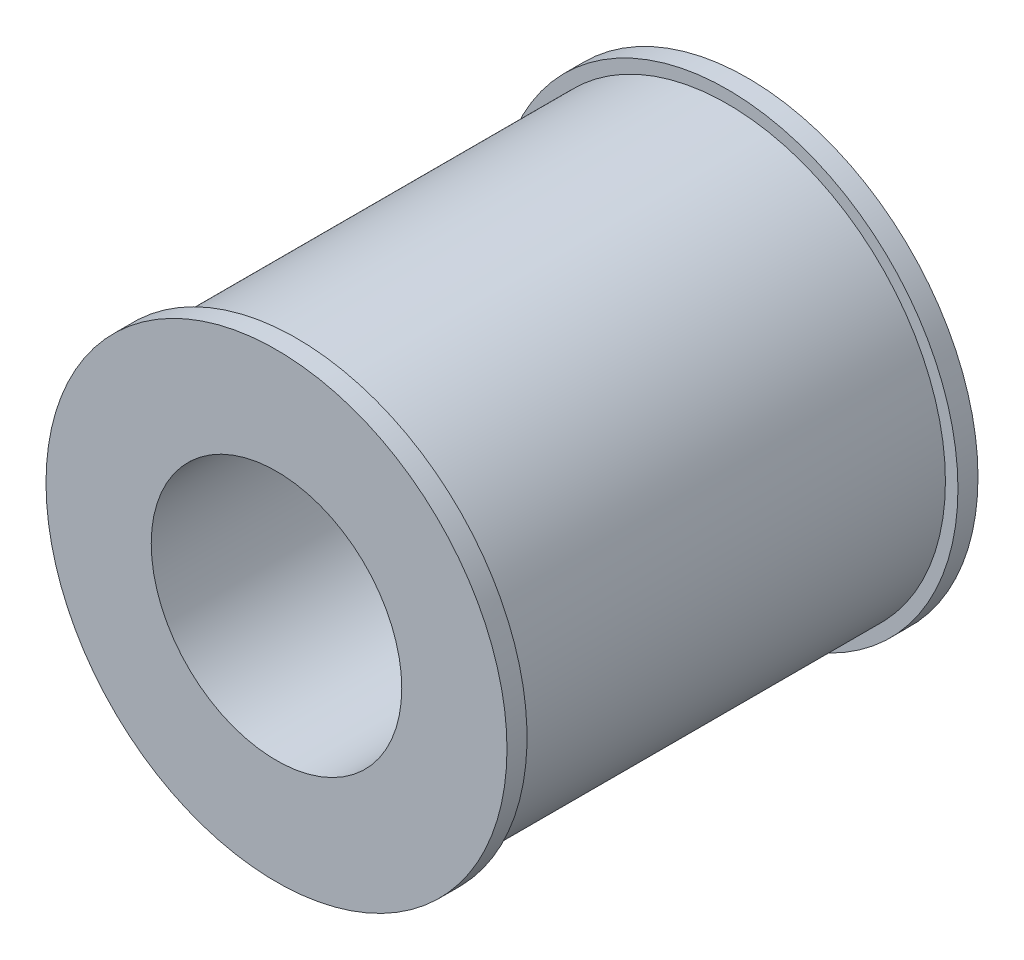
ISO-10303-21;
HEADER;
FILE_DESCRIPTION(('STEP AP214'),'2;1');
FILE_NAME('part.step','',(''),(''),'','','');
FILE_SCHEMA(('AUTOMOTIVE_DESIGN { 1 0 10303 214 1 1 1 1 }'));
ENDSEC;
DATA;
#1=APPLICATION_CONTEXT('core data for automotive mechanical design processes');
#2=APPLICATION_PROTOCOL_DEFINITION('international standard','automotive_design',2000,#1);
#3=PRODUCT_CONTEXT('',#1,'mechanical');
#4=PRODUCT('Part','Part','',(#3));
#5=PRODUCT_RELATED_PRODUCT_CATEGORY('part','',(#4));
#6=PRODUCT_DEFINITION_FORMATION('','',#4);
#7=PRODUCT_DEFINITION_CONTEXT('part definition',#1,'design');
#8=PRODUCT_DEFINITION('design','',#6,#7);
#9=PRODUCT_DEFINITION_SHAPE('','',#8);
#10=(LENGTH_UNIT() NAMED_UNIT(*) SI_UNIT(.MILLI.,.METRE.));
#11=(NAMED_UNIT(*) PLANE_ANGLE_UNIT() SI_UNIT($,.RADIAN.));
#12=(NAMED_UNIT(*) SI_UNIT($,.STERADIAN.) SOLID_ANGLE_UNIT());
#13=UNCERTAINTY_MEASURE_WITH_UNIT(LENGTH_MEASURE(1.E-05),#10,'distance_accuracy_value','');
#14=(GEOMETRIC_REPRESENTATION_CONTEXT(3) GLOBAL_UNCERTAINTY_ASSIGNED_CONTEXT((#13)) GLOBAL_UNIT_ASSIGNED_CONTEXT((#10,
#11,#12)) REPRESENTATION_CONTEXT('',''));
#15=CARTESIAN_POINT('',(0.,0.,0.));
#16=DIRECTION('',(0.,0.,1.));
#17=DIRECTION('',(1.,0.,0.));
#18=AXIS2_PLACEMENT_3D('',#15,#16,#17);
#19=CARTESIAN_POINT('',(0.,0.,47.));
#20=DIRECTION('',(0.,0.,-1.));
#21=DIRECTION('',(-1.,0.,0.));
#22=AXIS2_PLACEMENT_3D('',#19,#20,#21);
#23=CYLINDRICAL_SURFACE('',#22,23.);
#24=CARTESIAN_POINT('',(0.,0.,0.));
#25=DIRECTION('',(0.,0.,1.));
#26=DIRECTION('',(1.,0.,0.));
#27=AXIS2_PLACEMENT_3D('',#24,#25,#26);
#28=CIRCLE('',#27,23.);
#29=CARTESIAN_POINT('',(23.,0.,0.));
#30=VERTEX_POINT('',#29);
#31=EDGE_CURVE('E39',#30,#30,#28,.T.);
#32=ORIENTED_EDGE('',*,*,#31,.T.);
#33=EDGE_LOOP('',(#32));
#34=FACE_BOUND('',#33,.T.);
#35=CARTESIAN_POINT('',(0.,0.,2.));
#36=DIRECTION('',(0.,0.,1.));
#37=DIRECTION('',(1.,0.,0.));
#38=AXIS2_PLACEMENT_3D('',#35,#36,#37);
#39=CIRCLE('',#38,23.);
#40=CARTESIAN_POINT('',(23.,0.,2.));
#41=VERTEX_POINT('',#40);
#42=EDGE_CURVE('E35',#41,#41,#39,.T.);
#43=ORIENTED_EDGE('',*,*,#42,.F.);
#44=EDGE_LOOP('',(#43));
#45=FACE_BOUND('',#44,.T.);
#46=ADVANCED_FACE('F32',(#34,#45),#23,.T.);
#47=CARTESIAN_POINT('',(0.,0.,47.));
#48=DIRECTION('',(0.,0.,1.));
#49=DIRECTION('',(1.,0.,0.));
#50=AXIS2_PLACEMENT_3D('',#47,#48,#49);
#51=CIRCLE('',#50,23.);
#52=CARTESIAN_POINT('',(23.,0.,47.));
#53=VERTEX_POINT('',#52);
#54=EDGE_CURVE('E10',#53,#53,#51,.T.);
#55=ORIENTED_EDGE('',*,*,#54,.F.);
#56=EDGE_LOOP('',(#55));
#57=FACE_BOUND('',#56,.T.);
#58=CARTESIAN_POINT('',(0.,0.,45.));
#59=DIRECTION('',(0.,0.,-1.));
#60=DIRECTION('',(-1.,0.,0.));
#61=AXIS2_PLACEMENT_3D('',#58,#59,#60);
#62=CIRCLE('',#61,23.);
#63=CARTESIAN_POINT('',(-23.,0.,45.));
#64=VERTEX_POINT('',#63);
#65=EDGE_CURVE('E49',#64,#64,#62,.T.);
#66=ORIENTED_EDGE('',*,*,#65,.F.);
#67=EDGE_LOOP('',(#66));
#68=FACE_BOUND('',#67,.T.);
#69=ADVANCED_FACE('F85',(#57,#68),#23,.T.);
#70=CARTESIAN_POINT('',(0.,0.,47.));
#71=DIRECTION('',(0.,0.,1.));
#72=DIRECTION('',(1.,0.,0.));
#73=AXIS2_PLACEMENT_3D('',#70,#71,#72);
#74=PLANE('',#73);
#75=ORIENTED_EDGE('',*,*,#54,.T.);
#76=EDGE_LOOP('',(#75));
#77=FACE_BOUND('',#76,.T.);
#78=CARTESIAN_POINT('',(0.,0.,47.));
#79=DIRECTION('',(0.,0.,1.));
#80=DIRECTION('',(1.,0.,0.));
#81=AXIS2_PLACEMENT_3D('',#78,#79,#80);
#82=CIRCLE('',#81,12.5);
#83=CARTESIAN_POINT('',(12.5,0.,47.));
#84=VERTEX_POINT('',#83);
#85=EDGE_CURVE('E44',#84,#84,#82,.T.);
#86=ORIENTED_EDGE('',*,*,#85,.F.);
#87=EDGE_LOOP('',(#86));
#88=FACE_BOUND('',#87,.T.);
#89=ADVANCED_FACE('F81',(#77,#88),#74,.T.);
#90=CARTESIAN_POINT('',(0.,0.,0.));
#91=DIRECTION('',(0.,0.,1.));
#92=DIRECTION('',(1.,0.,0.));
#93=AXIS2_PLACEMENT_3D('',#90,#91,#92);
#94=PLANE('',#93);
#95=ORIENTED_EDGE('',*,*,#31,.F.);
#96=EDGE_LOOP('',(#95));
#97=FACE_BOUND('',#96,.T.);
#98=CARTESIAN_POINT('',(0.,0.,0.));
#99=DIRECTION('',(0.,0.,1.));
#100=DIRECTION('',(1.,0.,0.));
#101=AXIS2_PLACEMENT_3D('',#98,#99,#100);
#102=CIRCLE('',#101,12.5);
#103=CARTESIAN_POINT('',(12.5,0.,0.));
#104=VERTEX_POINT('',#103);
#105=EDGE_CURVE('E47',#104,#104,#102,.T.);
#106=ORIENTED_EDGE('',*,*,#105,.T.);
#107=EDGE_LOOP('',(#106));
#108=FACE_BOUND('',#107,.T.);
#109=ADVANCED_FACE('F68',(#97,#108),#94,.F.);
#110=CARTESIAN_POINT('',(0.,0.,47.));
#111=DIRECTION('',(0.,0.,-1.));
#112=DIRECTION('',(-1.,0.,0.));
#113=AXIS2_PLACEMENT_3D('',#110,#111,#112);
#114=CYLINDRICAL_SURFACE('',#113,12.5);
#115=ORIENTED_EDGE('',*,*,#85,.T.);
#116=EDGE_LOOP('',(#115));
#117=FACE_BOUND('',#116,.T.);
#118=ORIENTED_EDGE('',*,*,#105,.F.);
#119=EDGE_LOOP('',(#118));
#120=FACE_BOUND('',#119,.T.);
#121=ADVANCED_FACE('F70',(#117,#120),#114,.F.);
#122=CARTESIAN_POINT('',(0.,21.7500000000001,2.));
#123=DIRECTION('',(0.,0.,1.));
#124=DIRECTION('',(1.,0.,0.));
#125=AXIS2_PLACEMENT_3D('',#122,#123,#124);
#126=PLANE('',#125);
#127=CARTESIAN_POINT('',(0.,0.,2.));
#128=DIRECTION('',(0.,0.,1.));
#129=DIRECTION('',(1.,0.,0.));
#130=AXIS2_PLACEMENT_3D('',#127,#128,#129);
#131=CIRCLE('',#130,21.75);
#132=CARTESIAN_POINT('',(21.75,0.,2.));
#133=VERTEX_POINT('',#132);
#134=EDGE_CURVE('E51',#133,#133,#131,.T.);
#135=ORIENTED_EDGE('',*,*,#134,.F.);
#136=EDGE_LOOP('',(#135));
#137=FACE_BOUND('',#136,.T.);
#138=ORIENTED_EDGE('',*,*,#42,.T.);
#139=EDGE_LOOP('',(#138));
#140=FACE_BOUND('',#139,.T.);
#141=ADVANCED_FACE('F72',(#137,#140),#126,.T.);
#142=CARTESIAN_POINT('',(0.,21.7500000000001,45.));
#143=DIRECTION('',(0.,0.,-1.));
#144=DIRECTION('',(-1.,0.,0.));
#145=AXIS2_PLACEMENT_3D('',#142,#143,#144);
#146=PLANE('',#145);
#147=CARTESIAN_POINT('',(0.,0.,45.));
#148=DIRECTION('',(0.,0.,1.));
#149=DIRECTION('',(1.,0.,0.));
#150=AXIS2_PLACEMENT_3D('',#147,#148,#149);
#151=CIRCLE('',#150,21.75);
#152=CARTESIAN_POINT('',(21.75,0.,45.));
#153=VERTEX_POINT('',#152);
#154=EDGE_CURVE('E56',#153,#153,#151,.T.);
#155=ORIENTED_EDGE('',*,*,#154,.T.);
#156=EDGE_LOOP('',(#155));
#157=FACE_BOUND('',#156,.T.);
#158=ORIENTED_EDGE('',*,*,#65,.T.);
#159=EDGE_LOOP('',(#158));
#160=FACE_BOUND('',#159,.T.);
#161=ADVANCED_FACE('F78',(#157,#160),#146,.T.);
#162=CARTESIAN_POINT('',(0.,0.,47.));
#163=DIRECTION('',(0.,0.,1.));
#164=DIRECTION('',(1.,0.,0.));
#165=AXIS2_PLACEMENT_3D('',#162,#163,#164);
#166=CYLINDRICAL_SURFACE('',#165,21.75);
#167=ORIENTED_EDGE('',*,*,#134,.T.);
#168=EDGE_LOOP('',(#167));
#169=FACE_BOUND('',#168,.T.);
#170=ORIENTED_EDGE('',*,*,#154,.F.);
#171=EDGE_LOOP('',(#170));
#172=FACE_BOUND('',#171,.T.);
#173=ADVANCED_FACE('F127',(#169,#172),#166,.T.);
#174=CLOSED_SHELL('',(#46,#69,#89,#109,#121,#141,#161,#173));
#175=MANIFOLD_SOLID_BREP('B2',#174);
#176=ADVANCED_BREP_SHAPE_REPRESENTATION('',(#18,#175),#14);
#177=SHAPE_DEFINITION_REPRESENTATION(#9,#176);
ENDSEC;
END-ISO-10303-21;
